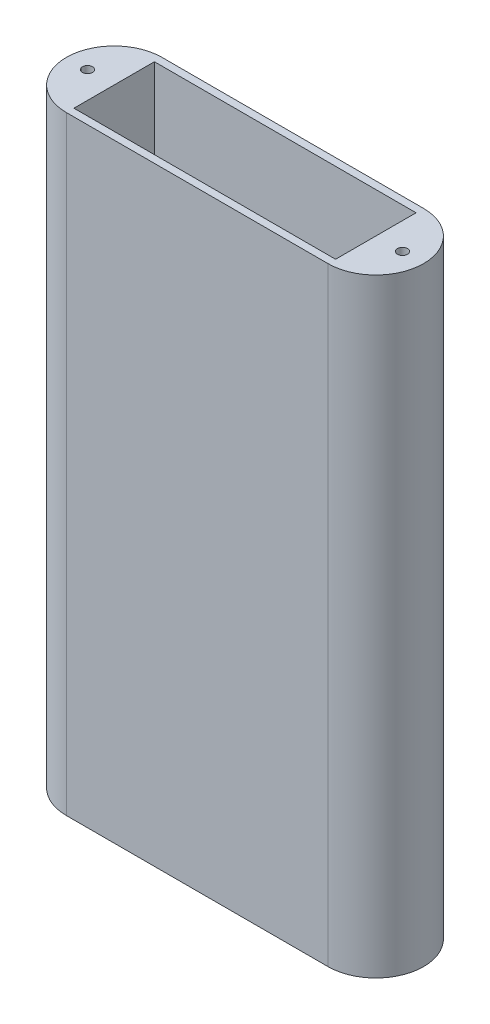
ISO-10303-21;
HEADER;
FILE_DESCRIPTION(('STEP AP214'),'2;1');
FILE_NAME('part.step','',(''),(''),'','','');
FILE_SCHEMA(('AUTOMOTIVE_DESIGN { 1 0 10303 214 1 1 1 1 }'));
ENDSEC;
DATA;
#1=APPLICATION_CONTEXT('core data for automotive mechanical design processes');
#2=APPLICATION_PROTOCOL_DEFINITION('international standard','automotive_design',2000,#1);
#3=PRODUCT_CONTEXT('',#1,'mechanical');
#4=PRODUCT('Part','Part','',(#3));
#5=PRODUCT_RELATED_PRODUCT_CATEGORY('part','',(#4));
#6=PRODUCT_DEFINITION_FORMATION('','',#4);
#7=PRODUCT_DEFINITION_CONTEXT('part definition',#1,'design');
#8=PRODUCT_DEFINITION('design','',#6,#7);
#9=PRODUCT_DEFINITION_SHAPE('','',#8);
#10=(LENGTH_UNIT() NAMED_UNIT(*) SI_UNIT(.MILLI.,.METRE.));
#11=(NAMED_UNIT(*) PLANE_ANGLE_UNIT() SI_UNIT($,.RADIAN.));
#12=(NAMED_UNIT(*) SI_UNIT($,.STERADIAN.) SOLID_ANGLE_UNIT());
#13=UNCERTAINTY_MEASURE_WITH_UNIT(LENGTH_MEASURE(1.E-05),#10,'distance_accuracy_value','');
#14=(GEOMETRIC_REPRESENTATION_CONTEXT(3) GLOBAL_UNCERTAINTY_ASSIGNED_CONTEXT((#13)) GLOBAL_UNIT_ASSIGNED_CONTEXT((#10,
#11,#12)) REPRESENTATION_CONTEXT('',''));
#15=CARTESIAN_POINT('',(0.,0.,0.));
#16=DIRECTION('',(0.,0.,1.));
#17=DIRECTION('',(1.,0.,0.));
#18=AXIS2_PLACEMENT_3D('',#15,#16,#17);
#19=CARTESIAN_POINT('',(-26.,60.5,0.));
#20=DIRECTION('',(0.,-1.,0.));
#21=DIRECTION('',(0.,0.,-1.));
#22=AXIS2_PLACEMENT_3D('',#19,#20,#21);
#23=CYLINDRICAL_SURFACE('',#22,9.50000000000001);
#24=CARTESIAN_POINT('',(-26.,-60.5,0.));
#25=DIRECTION('',(0.,1.,0.));
#26=DIRECTION('',(0.,0.,1.));
#27=AXIS2_PLACEMENT_3D('',#24,#25,#26);
#28=CIRCLE('',#27,9.50000000000001);
#29=CARTESIAN_POINT('',(-26.,-60.5,-9.50000000000001));
#30=VERTEX_POINT('',#29);
#31=CARTESIAN_POINT('',(-26.,-60.5,9.50000000000001));
#32=VERTEX_POINT('',#31);
#33=EDGE_CURVE('E139',#30,#32,#28,.T.);
#34=ORIENTED_EDGE('',*,*,#33,.T.);
#35=DIRECTION('',(0.,-1.,0.));
#36=VECTOR('',#35,1.);
#37=CARTESIAN_POINT('',(-26.,60.5,9.50000000000001));
#38=LINE('',#37,#36);
#39=CARTESIAN_POINT('',(-26.,60.5,9.50000000000001));
#40=VERTEX_POINT('',#39);
#41=EDGE_CURVE('E11',#40,#32,#38,.T.);
#42=ORIENTED_EDGE('',*,*,#41,.F.);
#43=CARTESIAN_POINT('',(-26.,60.5,0.));
#44=DIRECTION('',(0.,1.,0.));
#45=DIRECTION('',(0.,0.,1.));
#46=AXIS2_PLACEMENT_3D('',#43,#44,#45);
#47=CIRCLE('',#46,9.50000000000001);
#48=CARTESIAN_POINT('',(-26.,60.5,-9.50000000000001));
#49=VERTEX_POINT('',#48);
#50=EDGE_CURVE('E146',#49,#40,#47,.T.);
#51=ORIENTED_EDGE('',*,*,#50,.F.);
#52=DIRECTION('',(0.,-1.,0.));
#53=VECTOR('',#52,1.);
#54=CARTESIAN_POINT('',(-26.,60.5,-9.50000000000001));
#55=LINE('',#54,#53);
#56=EDGE_CURVE('E156',#49,#30,#55,.T.);
#57=ORIENTED_EDGE('',*,*,#56,.T.);
#58=EDGE_LOOP('',(#34,#42,#51,#57));
#59=FACE_BOUND('',#58,.T.);
#60=ADVANCED_FACE('F33',(#59),#23,.T.);
#61=CARTESIAN_POINT('',(-26.,60.5,9.50000000000001));
#62=DIRECTION('',(0.,0.,-1.));
#63=DIRECTION('',(-1.,0.,0.));
#64=AXIS2_PLACEMENT_3D('',#61,#62,#63);
#65=PLANE('',#64);
#66=DIRECTION('',(1.,0.,0.));
#67=VECTOR('',#66,1.);
#68=CARTESIAN_POINT('',(-26.,-60.5,9.50000000000001));
#69=LINE('',#68,#67);
#70=CARTESIAN_POINT('',(26.,-60.5,9.5));
#71=VERTEX_POINT('',#70);
#72=EDGE_CURVE('E159',#32,#71,#69,.T.);
#73=ORIENTED_EDGE('',*,*,#72,.T.);
#74=DIRECTION('',(0.,-1.,0.));
#75=VECTOR('',#74,1.);
#76=CARTESIAN_POINT('',(26.,60.5,9.5));
#77=LINE('',#76,#75);
#78=CARTESIAN_POINT('',(26.,60.5,9.5));
#79=VERTEX_POINT('',#78);
#80=EDGE_CURVE('E40',#79,#71,#77,.T.);
#81=ORIENTED_EDGE('',*,*,#80,.F.);
#82=DIRECTION('',(1.,0.,0.));
#83=VECTOR('',#82,1.);
#84=CARTESIAN_POINT('',(-26.,60.5,9.50000000000001));
#85=LINE('',#84,#83);
#86=EDGE_CURVE('E149',#40,#79,#85,.T.);
#87=ORIENTED_EDGE('',*,*,#86,.F.);
#88=ORIENTED_EDGE('',*,*,#41,.T.);
#89=EDGE_LOOP('',(#73,#81,#87,#88));
#90=FACE_BOUND('',#89,.T.);
#91=ADVANCED_FACE('F189',(#90),#65,.F.);
#92=CARTESIAN_POINT('',(26.,60.5,0.));
#93=DIRECTION('',(0.,-1.,0.));
#94=DIRECTION('',(0.,0.,-1.));
#95=AXIS2_PLACEMENT_3D('',#92,#93,#94);
#96=CYLINDRICAL_SURFACE('',#95,9.50000000000001);
#97=CARTESIAN_POINT('',(26.,-60.5,0.));
#98=DIRECTION('',(0.,1.,0.));
#99=DIRECTION('',(0.,0.,1.));
#100=AXIS2_PLACEMENT_3D('',#97,#98,#99);
#101=CIRCLE('',#100,9.50000000000001);
#102=CARTESIAN_POINT('',(26.,-60.5,-9.50000000000001));
#103=VERTEX_POINT('',#102);
#104=EDGE_CURVE('E161',#71,#103,#101,.T.);
#105=ORIENTED_EDGE('',*,*,#104,.T.);
#106=DIRECTION('',(0.,-1.,0.));
#107=VECTOR('',#106,1.);
#108=CARTESIAN_POINT('',(26.,60.5,-9.50000000000001));
#109=LINE('',#108,#107);
#110=CARTESIAN_POINT('',(26.,60.5,-9.50000000000001));
#111=VERTEX_POINT('',#110);
#112=EDGE_CURVE('E166',#111,#103,#109,.T.);
#113=ORIENTED_EDGE('',*,*,#112,.F.);
#114=CARTESIAN_POINT('',(26.,60.5,0.));
#115=DIRECTION('',(0.,1.,0.));
#116=DIRECTION('',(0.,0.,1.));
#117=AXIS2_PLACEMENT_3D('',#114,#115,#116);
#118=CIRCLE('',#117,9.50000000000001);
#119=EDGE_CURVE('E152',#79,#111,#118,.T.);
#120=ORIENTED_EDGE('',*,*,#119,.F.);
#121=ORIENTED_EDGE('',*,*,#80,.T.);
#122=EDGE_LOOP('',(#105,#113,#120,#121));
#123=FACE_BOUND('',#122,.T.);
#124=ADVANCED_FACE('F173',(#123),#96,.T.);
#125=CARTESIAN_POINT('',(-26.,60.5,-9.50000000000001));
#126=DIRECTION('',(0.,0.,1.));
#127=DIRECTION('',(1.,0.,0.));
#128=AXIS2_PLACEMENT_3D('',#125,#126,#127);
#129=PLANE('',#128);
#130=DIRECTION('',(-1.,0.,0.));
#131=VECTOR('',#130,1.);
#132=CARTESIAN_POINT('',(-26.,-60.5,-9.50000000000001));
#133=LINE('',#132,#131);
#134=EDGE_CURVE('E150',#103,#30,#133,.T.);
#135=ORIENTED_EDGE('',*,*,#134,.T.);
#136=ORIENTED_EDGE('',*,*,#56,.F.);
#137=DIRECTION('',(-1.,0.,0.));
#138=VECTOR('',#137,1.);
#139=CARTESIAN_POINT('',(-26.,60.5,-9.50000000000001));
#140=LINE('',#139,#138);
#141=EDGE_CURVE('E154',#111,#49,#140,.T.);
#142=ORIENTED_EDGE('',*,*,#141,.F.);
#143=ORIENTED_EDGE('',*,*,#112,.T.);
#144=EDGE_LOOP('',(#135,#136,#142,#143));
#145=FACE_BOUND('',#144,.T.);
#146=ADVANCED_FACE('F181',(#145),#129,.F.);
#147=CARTESIAN_POINT('',(-26.,60.5,0.));
#148=DIRECTION('',(0.,1.,0.));
#149=DIRECTION('',(0.,0.,1.));
#150=AXIS2_PLACEMENT_3D('',#147,#148,#149);
#151=PLANE('',#150);
#152=DIRECTION('',(1.,0.,0.));
#153=VECTOR('',#152,1.);
#154=CARTESIAN_POINT('',(-26.,60.5,8.00000000000001));
#155=LINE('',#154,#153);
#156=CARTESIAN_POINT('',(-26.,60.5,8.00000000000001));
#157=VERTEX_POINT('',#156);
#158=CARTESIAN_POINT('',(26.,60.5,8.00000000000001));
#159=VERTEX_POINT('',#158);
#160=EDGE_CURVE('E104',#157,#159,#155,.T.);
#161=ORIENTED_EDGE('',*,*,#160,.F.);
#162=DIRECTION('',(0.,0.,-1.));
#163=VECTOR('',#162,1.);
#164=CARTESIAN_POINT('',(-26.,60.5,0.));
#165=LINE('',#164,#163);
#166=CARTESIAN_POINT('',(-26.,60.5,-8.00000000000001));
#167=VERTEX_POINT('',#166);
#168=EDGE_CURVE('E129',#157,#167,#165,.T.);
#169=ORIENTED_EDGE('',*,*,#168,.T.);
#170=DIRECTION('',(-1.,0.,0.));
#171=VECTOR('',#170,1.);
#172=CARTESIAN_POINT('',(-26.,60.5,-8.00000000000001));
#173=LINE('',#172,#171);
#174=CARTESIAN_POINT('',(26.,60.5,-8.00000000000001));
#175=VERTEX_POINT('',#174);
#176=EDGE_CURVE('E141',#175,#167,#173,.T.);
#177=ORIENTED_EDGE('',*,*,#176,.F.);
#178=DIRECTION('',(0.,0.,-1.));
#179=VECTOR('',#178,1.);
#180=CARTESIAN_POINT('',(26.,60.5,0.));
#181=LINE('',#180,#179);
#182=EDGE_CURVE('E113',#159,#175,#181,.T.);
#183=ORIENTED_EDGE('',*,*,#182,.F.);
#184=EDGE_LOOP('',(#161,#169,#177,#183));
#185=FACE_BOUND('',#184,.T.);
#186=ORIENTED_EDGE('',*,*,#50,.T.);
#187=ORIENTED_EDGE('',*,*,#86,.T.);
#188=ORIENTED_EDGE('',*,*,#119,.T.);
#189=ORIENTED_EDGE('',*,*,#141,.T.);
#190=EDGE_LOOP('',(#186,#187,#188,#189));
#191=FACE_BOUND('',#190,.T.);
#192=CARTESIAN_POINT('',(-31.3,60.5,0.));
#193=DIRECTION('',(0.,1.,0.));
#194=DIRECTION('',(0.,0.,1.));
#195=AXIS2_PLACEMENT_3D('',#192,#193,#194);
#196=CIRCLE('',#195,1.);
#197=CARTESIAN_POINT('',(-31.3,60.5,1.));
#198=VERTEX_POINT('',#197);
#199=EDGE_CURVE('E126',#198,#198,#196,.T.);
#200=ORIENTED_EDGE('',*,*,#199,.F.);
#201=EDGE_LOOP('',(#200));
#202=FACE_BOUND('',#201,.T.);
#203=CARTESIAN_POINT('',(31.3,60.5,0.));
#204=DIRECTION('',(0.,-1.,0.));
#205=DIRECTION('',(0.,0.,1.));
#206=AXIS2_PLACEMENT_3D('',#203,#204,#205);
#207=CIRCLE('',#206,1.);
#208=CARTESIAN_POINT('',(31.3,60.5,1.));
#209=VERTEX_POINT('',#208);
#210=EDGE_CURVE('E117',#209,#209,#207,.T.);
#211=ORIENTED_EDGE('',*,*,#210,.T.);
#212=EDGE_LOOP('',(#211));
#213=FACE_BOUND('',#212,.T.);
#214=ADVANCED_FACE('F187',(#185,#191,#202,#213),#151,.T.);
#215=CARTESIAN_POINT('',(-26.,-60.5,0.));
#216=DIRECTION('',(0.,1.,0.));
#217=DIRECTION('',(0.,0.,1.));
#218=AXIS2_PLACEMENT_3D('',#215,#216,#217);
#219=PLANE('',#218);
#220=DIRECTION('',(-1.,0.,0.));
#221=VECTOR('',#220,1.);
#222=CARTESIAN_POINT('',(-26.,-60.5,-8.00000000000001));
#223=LINE('',#222,#221);
#224=CARTESIAN_POINT('',(26.,-60.5,-8.00000000000001));
#225=VERTEX_POINT('',#224);
#226=CARTESIAN_POINT('',(-26.,-60.5,-8.00000000000001));
#227=VERTEX_POINT('',#226);
#228=EDGE_CURVE('E98',#225,#227,#223,.T.);
#229=ORIENTED_EDGE('',*,*,#228,.T.);
#230=DIRECTION('',(0.,0.,-1.));
#231=VECTOR('',#230,1.);
#232=CARTESIAN_POINT('',(-26.,-60.5,0.));
#233=LINE('',#232,#231);
#234=CARTESIAN_POINT('',(-26.,-60.5,8.00000000000001));
#235=VERTEX_POINT('',#234);
#236=EDGE_CURVE('E130',#235,#227,#233,.T.);
#237=ORIENTED_EDGE('',*,*,#236,.F.);
#238=DIRECTION('',(1.,0.,0.));
#239=VECTOR('',#238,1.);
#240=CARTESIAN_POINT('',(-26.,-60.5,8.00000000000001));
#241=LINE('',#240,#239);
#242=CARTESIAN_POINT('',(26.,-60.5,8.00000000000001));
#243=VERTEX_POINT('',#242);
#244=EDGE_CURVE('E105',#235,#243,#241,.T.);
#245=ORIENTED_EDGE('',*,*,#244,.T.);
#246=DIRECTION('',(0.,0.,-1.));
#247=VECTOR('',#246,1.);
#248=CARTESIAN_POINT('',(26.,-60.5,0.));
#249=LINE('',#248,#247);
#250=EDGE_CURVE('E111',#243,#225,#249,.T.);
#251=ORIENTED_EDGE('',*,*,#250,.T.);
#252=EDGE_LOOP('',(#229,#237,#245,#251));
#253=FACE_BOUND('',#252,.T.);
#254=ORIENTED_EDGE('',*,*,#33,.F.);
#255=ORIENTED_EDGE('',*,*,#134,.F.);
#256=ORIENTED_EDGE('',*,*,#104,.F.);
#257=ORIENTED_EDGE('',*,*,#72,.F.);
#258=EDGE_LOOP('',(#254,#255,#256,#257));
#259=FACE_BOUND('',#258,.T.);
#260=CARTESIAN_POINT('',(-31.3,-60.5,0.));
#261=DIRECTION('',(0.,1.,0.));
#262=DIRECTION('',(0.,0.,1.));
#263=AXIS2_PLACEMENT_3D('',#260,#261,#262);
#264=CIRCLE('',#263,1.);
#265=CARTESIAN_POINT('',(-31.3,-60.5,1.));
#266=VERTEX_POINT('',#265);
#267=EDGE_CURVE('E132',#266,#266,#264,.T.);
#268=ORIENTED_EDGE('',*,*,#267,.T.);
#269=EDGE_LOOP('',(#268));
#270=FACE_BOUND('',#269,.T.);
#271=CARTESIAN_POINT('',(31.3,-60.5,0.));
#272=DIRECTION('',(0.,-1.,0.));
#273=DIRECTION('',(0.,0.,1.));
#274=AXIS2_PLACEMENT_3D('',#271,#272,#273);
#275=CIRCLE('',#274,1.);
#276=CARTESIAN_POINT('',(31.3,-60.5,1.));
#277=VERTEX_POINT('',#276);
#278=EDGE_CURVE('E118',#277,#277,#275,.T.);
#279=ORIENTED_EDGE('',*,*,#278,.F.);
#280=EDGE_LOOP('',(#279));
#281=FACE_BOUND('',#280,.T.);
#282=ADVANCED_FACE('F115',(#253,#259,#270,#281),#219,.F.);
#283=CARTESIAN_POINT('',(-26.,60.5,8.00000000000001));
#284=DIRECTION('',(0.,0.,-1.));
#285=DIRECTION('',(-1.,0.,0.));
#286=AXIS2_PLACEMENT_3D('',#283,#284,#285);
#287=PLANE('',#286);
#288=ORIENTED_EDGE('',*,*,#244,.F.);
#289=DIRECTION('',(0.,1.,0.));
#290=VECTOR('',#289,1.);
#291=CARTESIAN_POINT('',(-26.,60.5,8.00000000000001));
#292=LINE('',#291,#290);
#293=EDGE_CURVE('E136',#157,#235,#292,.F.);
#294=ORIENTED_EDGE('',*,*,#293,.F.);
#295=ORIENTED_EDGE('',*,*,#160,.T.);
#296=DIRECTION('',(0.,-1.,0.));
#297=VECTOR('',#296,1.);
#298=CARTESIAN_POINT('',(26.,60.5,8.));
#299=LINE('',#298,#297);
#300=EDGE_CURVE('E55',#159,#243,#299,.T.);
#301=ORIENTED_EDGE('',*,*,#300,.T.);
#302=EDGE_LOOP('',(#288,#294,#295,#301));
#303=FACE_BOUND('',#302,.T.);
#304=ADVANCED_FACE('F201',(#303),#287,.T.);
#305=CARTESIAN_POINT('',(-26.,60.5,-8.00000000000001));
#306=DIRECTION('',(0.,0.,1.));
#307=DIRECTION('',(1.,0.,0.));
#308=AXIS2_PLACEMENT_3D('',#305,#306,#307);
#309=PLANE('',#308);
#310=ORIENTED_EDGE('',*,*,#228,.F.);
#311=DIRECTION('',(0.,1.,0.));
#312=VECTOR('',#311,1.);
#313=CARTESIAN_POINT('',(26.,60.5,-8.00000000000001));
#314=LINE('',#313,#312);
#315=EDGE_CURVE('E47',#175,#225,#314,.F.);
#316=ORIENTED_EDGE('',*,*,#315,.F.);
#317=ORIENTED_EDGE('',*,*,#176,.T.);
#318=DIRECTION('',(0.,-1.,0.));
#319=VECTOR('',#318,1.);
#320=CARTESIAN_POINT('',(-26.,60.5,-8.));
#321=LINE('',#320,#319);
#322=EDGE_CURVE('E101',#167,#227,#321,.T.);
#323=ORIENTED_EDGE('',*,*,#322,.T.);
#324=EDGE_LOOP('',(#310,#316,#317,#323));
#325=FACE_BOUND('',#324,.T.);
#326=ADVANCED_FACE('F99',(#325),#309,.T.);
#327=CARTESIAN_POINT('',(-31.3,60.5,0.));
#328=DIRECTION('',(0.,-1.,0.));
#329=DIRECTION('',(0.,0.,-1.));
#330=AXIS2_PLACEMENT_3D('',#327,#328,#329);
#331=CYLINDRICAL_SURFACE('',#330,1.);
#332=ORIENTED_EDGE('',*,*,#199,.T.);
#333=EDGE_LOOP('',(#332));
#334=FACE_BOUND('',#333,.T.);
#335=ORIENTED_EDGE('',*,*,#267,.F.);
#336=EDGE_LOOP('',(#335));
#337=FACE_BOUND('',#336,.T.);
#338=ADVANCED_FACE('F207',(#334,#337),#331,.F.);
#339=CARTESIAN_POINT('',(-26.,60.5,0.));
#340=DIRECTION('',(-1.,0.,0.));
#341=DIRECTION('',(0.,0.,1.));
#342=AXIS2_PLACEMENT_3D('',#339,#340,#341);
#343=PLANE('',#342);
#344=ORIENTED_EDGE('',*,*,#236,.T.);
#345=ORIENTED_EDGE('',*,*,#322,.F.);
#346=ORIENTED_EDGE('',*,*,#168,.F.);
#347=ORIENTED_EDGE('',*,*,#293,.T.);
#348=EDGE_LOOP('',(#344,#345,#346,#347));
#349=FACE_BOUND('',#348,.T.);
#350=ADVANCED_FACE('F212',(#349),#343,.F.);
#351=CARTESIAN_POINT('',(31.3,60.5,0.));
#352=DIRECTION('',(0.,-1.,0.));
#353=DIRECTION('',(0.,0.,-1.));
#354=AXIS2_PLACEMENT_3D('',#351,#352,#353);
#355=CYLINDRICAL_SURFACE('',#354,1.);
#356=ORIENTED_EDGE('',*,*,#210,.F.);
#357=EDGE_LOOP('',(#356));
#358=FACE_BOUND('',#357,.T.);
#359=ORIENTED_EDGE('',*,*,#278,.T.);
#360=EDGE_LOOP('',(#359));
#361=FACE_BOUND('',#360,.T.);
#362=ADVANCED_FACE('F216',(#358,#361),#355,.F.);
#363=CARTESIAN_POINT('',(26.,60.5,0.));
#364=DIRECTION('',(-1.,0.,0.));
#365=DIRECTION('',(0.,0.,1.));
#366=AXIS2_PLACEMENT_3D('',#363,#364,#365);
#367=PLANE('',#366);
#368=ORIENTED_EDGE('',*,*,#250,.F.);
#369=ORIENTED_EDGE('',*,*,#300,.F.);
#370=ORIENTED_EDGE('',*,*,#182,.T.);
#371=ORIENTED_EDGE('',*,*,#315,.T.);
#372=EDGE_LOOP('',(#368,#369,#370,#371));
#373=FACE_BOUND('',#372,.T.);
#374=ADVANCED_FACE('F110',(#373),#367,.T.);
#375=CLOSED_SHELL('',(#60,#91,#124,#146,#214,#282,#304,#326,#338,#350,#362,#374));
#376=MANIFOLD_SOLID_BREP('B2',#375);
#377=ADVANCED_BREP_SHAPE_REPRESENTATION('',(#18,#376),#14);
#378=SHAPE_DEFINITION_REPRESENTATION(#9,#377);
ENDSEC;
END-ISO-10303-21;
